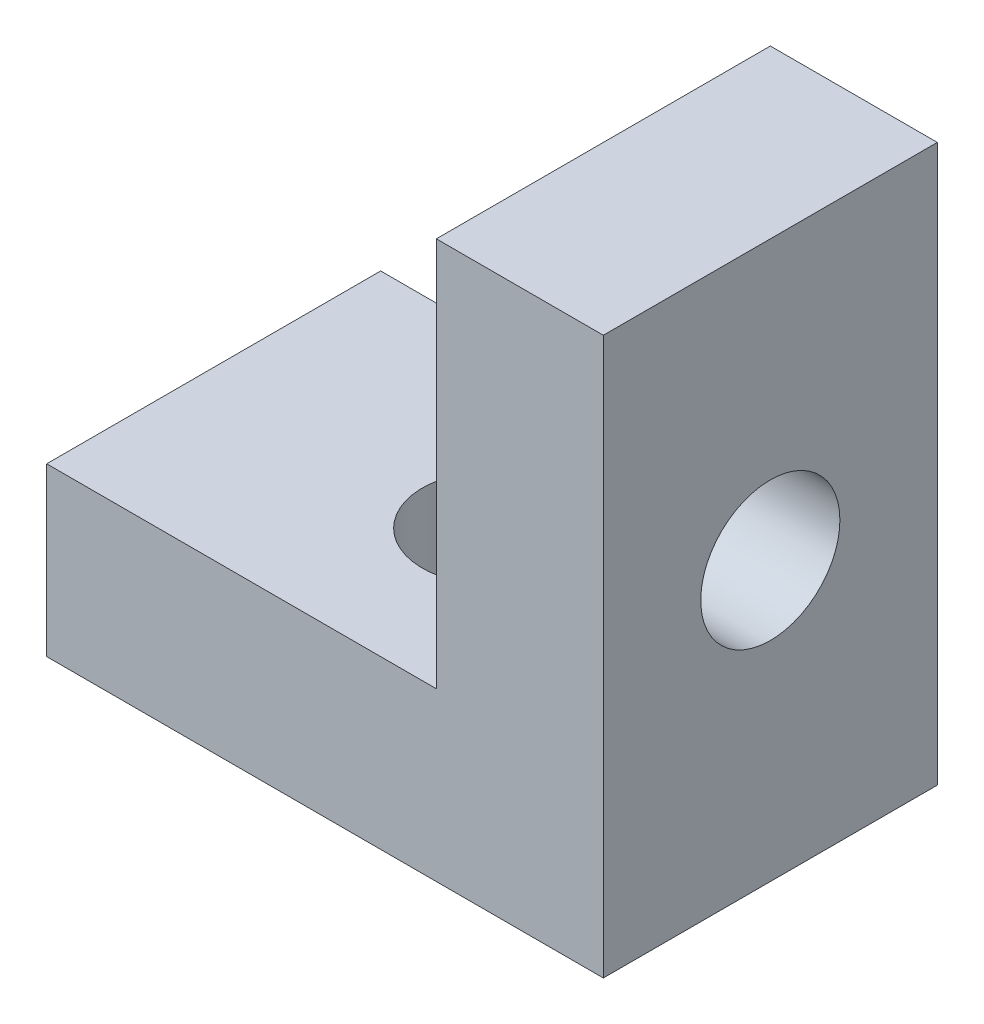
ISO-10303-21;
HEADER;
FILE_DESCRIPTION(('STEP AP214'),'2;1');
FILE_NAME('part.step','',(''),(''),'','','');
FILE_SCHEMA(('AUTOMOTIVE_DESIGN { 1 0 10303 214 1 1 1 1 }'));
ENDSEC;
DATA;
#1=APPLICATION_CONTEXT('core data for automotive mechanical design processes');
#2=APPLICATION_PROTOCOL_DEFINITION('international standard','automotive_design',2000,#1);
#3=PRODUCT_CONTEXT('',#1,'mechanical');
#4=PRODUCT('Part','Part','',(#3));
#5=PRODUCT_RELATED_PRODUCT_CATEGORY('part','',(#4));
#6=PRODUCT_DEFINITION_FORMATION('','',#4);
#7=PRODUCT_DEFINITION_CONTEXT('part definition',#1,'design');
#8=PRODUCT_DEFINITION('design','',#6,#7);
#9=PRODUCT_DEFINITION_SHAPE('','',#8);
#10=(LENGTH_UNIT() NAMED_UNIT(*) SI_UNIT(.MILLI.,.METRE.));
#11=(NAMED_UNIT(*) PLANE_ANGLE_UNIT() SI_UNIT($,.RADIAN.));
#12=(NAMED_UNIT(*) SI_UNIT($,.STERADIAN.) SOLID_ANGLE_UNIT());
#13=UNCERTAINTY_MEASURE_WITH_UNIT(LENGTH_MEASURE(1.E-05),#10,'distance_accuracy_value','');
#14=(GEOMETRIC_REPRESENTATION_CONTEXT(3) GLOBAL_UNCERTAINTY_ASSIGNED_CONTEXT((#13)) GLOBAL_UNIT_ASSIGNED_CONTEXT((#10,
#11,#12)) REPRESENTATION_CONTEXT('',''));
#15=CARTESIAN_POINT('',(0.,0.,0.));
#16=DIRECTION('',(0.,0.,1.));
#17=DIRECTION('',(1.,0.,0.));
#18=AXIS2_PLACEMENT_3D('',#15,#16,#17);
#19=CARTESIAN_POINT('',(7.,0.,6.));
#20=DIRECTION('',(0.,-1.,0.));
#21=DIRECTION('',(1.,0.,0.));
#22=AXIS2_PLACEMENT_3D('',#19,#20,#21);
#23=PLANE('',#22);
#24=CARTESIAN_POINT('',(5.,0.,3.));
#25=DIRECTION('',(0.,-1.,0.));
#26=DIRECTION('',(1.,0.,0.));
#27=AXIS2_PLACEMENT_3D('',#24,#25,#26);
#28=CIRCLE('',#27,1.24999999999999);
#29=CARTESIAN_POINT('',(6.24999999999999,0.,3.));
#30=VERTEX_POINT('',#29);
#31=EDGE_CURVE('E123',#30,#30,#28,.T.);
#32=ORIENTED_EDGE('',*,*,#31,.T.);
#33=EDGE_LOOP('',(#32));
#34=FACE_BOUND('',#33,.T.);
#35=DIRECTION('',(-1.,0.,0.));
#36=VECTOR('',#35,1.);
#37=CARTESIAN_POINT('',(7.,0.,0.));
#38=LINE('',#37,#36);
#39=CARTESIAN_POINT('',(7.,0.,0.));
#40=VERTEX_POINT('',#39);
#41=CARTESIAN_POINT('',(0.,0.,0.));
#42=VERTEX_POINT('',#41);
#43=EDGE_CURVE('E119',#40,#42,#38,.T.);
#44=ORIENTED_EDGE('',*,*,#43,.T.);
#45=DIRECTION('',(0.,0.,-1.));
#46=VECTOR('',#45,1.);
#47=CARTESIAN_POINT('',(0.,0.,6.));
#48=LINE('',#47,#46);
#49=CARTESIAN_POINT('',(0.,0.,6.));
#50=VERTEX_POINT('',#49);
#51=EDGE_CURVE('E11',#50,#42,#48,.T.);
#52=ORIENTED_EDGE('',*,*,#51,.F.);
#53=DIRECTION('',(-1.,0.,0.));
#54=VECTOR('',#53,1.);
#55=CARTESIAN_POINT('',(7.,0.,6.));
#56=LINE('',#55,#54);
#57=CARTESIAN_POINT('',(7.,0.,6.));
#58=VERTEX_POINT('',#57);
#59=EDGE_CURVE('E130',#58,#50,#56,.T.);
#60=ORIENTED_EDGE('',*,*,#59,.F.);
#61=DIRECTION('',(0.,0.,-1.));
#62=VECTOR('',#61,1.);
#63=CARTESIAN_POINT('',(7.,0.,6.));
#64=LINE('',#63,#62);
#65=EDGE_CURVE('E115',#58,#40,#64,.T.);
#66=ORIENTED_EDGE('',*,*,#65,.T.);
#67=EDGE_LOOP('',(#44,#52,#60,#66));
#68=FACE_BOUND('',#67,.T.);
#69=ADVANCED_FACE('F35',(#34,#68),#23,.F.);
#70=CARTESIAN_POINT('',(0.,0.,6.));
#71=DIRECTION('',(1.,0.,0.));
#72=DIRECTION('',(0.,0.,-1.));
#73=AXIS2_PLACEMENT_3D('',#70,#71,#72);
#74=PLANE('',#73);
#75=DIRECTION('',(0.,-1.,0.));
#76=VECTOR('',#75,1.);
#77=CARTESIAN_POINT('',(0.,0.,0.));
#78=LINE('',#77,#76);
#79=CARTESIAN_POINT('',(0.,-3.,0.));
#80=VERTEX_POINT('',#79);
#81=EDGE_CURVE('E122',#42,#80,#78,.T.);
#82=ORIENTED_EDGE('',*,*,#81,.T.);
#83=DIRECTION('',(0.,0.,-1.));
#84=VECTOR('',#83,1.);
#85=CARTESIAN_POINT('',(0.,-3.,6.));
#86=LINE('',#85,#84);
#87=CARTESIAN_POINT('',(0.,-3.,6.));
#88=VERTEX_POINT('',#87);
#89=EDGE_CURVE('E43',#88,#80,#86,.T.);
#90=ORIENTED_EDGE('',*,*,#89,.F.);
#91=DIRECTION('',(0.,-1.,0.));
#92=VECTOR('',#91,1.);
#93=CARTESIAN_POINT('',(0.,0.,6.));
#94=LINE('',#93,#92);
#95=EDGE_CURVE('E88',#50,#88,#94,.T.);
#96=ORIENTED_EDGE('',*,*,#95,.F.);
#97=ORIENTED_EDGE('',*,*,#51,.T.);
#98=EDGE_LOOP('',(#82,#90,#96,#97));
#99=FACE_BOUND('',#98,.T.);
#100=ADVANCED_FACE('F156',(#99),#74,.F.);
#101=CARTESIAN_POINT('',(0.,-3.,6.));
#102=DIRECTION('',(0.,1.,0.));
#103=DIRECTION('',(-1.,0.,0.));
#104=AXIS2_PLACEMENT_3D('',#101,#102,#103);
#105=PLANE('',#104);
#106=CARTESIAN_POINT('',(5.,-3.,3.));
#107=DIRECTION('',(0.,-1.,0.));
#108=DIRECTION('',(0.,0.,-1.));
#109=AXIS2_PLACEMENT_3D('',#106,#107,#108);
#110=CIRCLE('',#109,1.24999999999999);
#111=CARTESIAN_POINT('',(5.,-3.,1.75000000000001));
#112=VERTEX_POINT('',#111);
#113=EDGE_CURVE('E164',#112,#112,#110,.T.);
#114=ORIENTED_EDGE('',*,*,#113,.F.);
#115=EDGE_LOOP('',(#114));
#116=FACE_BOUND('',#115,.T.);
#117=DIRECTION('',(1.,0.,0.));
#118=VECTOR('',#117,1.);
#119=CARTESIAN_POINT('',(0.,-3.,0.));
#120=LINE('',#119,#118);
#121=CARTESIAN_POINT('',(10.,-3.,0.));
#122=VERTEX_POINT('',#121);
#123=EDGE_CURVE('E125',#80,#122,#120,.T.);
#124=ORIENTED_EDGE('',*,*,#123,.T.);
#125=DIRECTION('',(0.,0.,-1.));
#126=VECTOR('',#125,1.);
#127=CARTESIAN_POINT('',(10.,-3.,6.));
#128=LINE('',#127,#126);
#129=CARTESIAN_POINT('',(10.,-3.,6.));
#130=VERTEX_POINT('',#129);
#131=EDGE_CURVE('E110',#130,#122,#128,.T.);
#132=ORIENTED_EDGE('',*,*,#131,.F.);
#133=DIRECTION('',(1.,0.,0.));
#134=VECTOR('',#133,1.);
#135=CARTESIAN_POINT('',(0.,-3.,6.));
#136=LINE('',#135,#134);
#137=EDGE_CURVE('E101',#88,#130,#136,.T.);
#138=ORIENTED_EDGE('',*,*,#137,.F.);
#139=ORIENTED_EDGE('',*,*,#89,.T.);
#140=EDGE_LOOP('',(#124,#132,#138,#139));
#141=FACE_BOUND('',#140,.T.);
#142=ADVANCED_FACE('F136',(#116,#141),#105,.F.);
#143=CARTESIAN_POINT('',(10.,-3.,6.));
#144=DIRECTION('',(-1.,0.,0.));
#145=DIRECTION('',(0.,-1.,0.));
#146=AXIS2_PLACEMENT_3D('',#143,#144,#145);
#147=PLANE('',#146);
#148=CARTESIAN_POINT('',(10.,2.,3.));
#149=DIRECTION('',(1.,0.,0.));
#150=DIRECTION('',(0.,0.,-1.));
#151=AXIS2_PLACEMENT_3D('',#148,#149,#150);
#152=CIRCLE('',#151,1.24999999999999);
#153=CARTESIAN_POINT('',(10.,2.,1.75000000000001));
#154=VERTEX_POINT('',#153);
#155=EDGE_CURVE('E173',#154,#154,#152,.T.);
#156=ORIENTED_EDGE('',*,*,#155,.F.);
#157=EDGE_LOOP('',(#156));
#158=FACE_BOUND('',#157,.T.);
#159=DIRECTION('',(0.,1.,0.));
#160=VECTOR('',#159,1.);
#161=CARTESIAN_POINT('',(10.,-3.,0.));
#162=LINE('',#161,#160);
#163=CARTESIAN_POINT('',(10.,7.,0.));
#164=VERTEX_POINT('',#163);
#165=EDGE_CURVE('E109',#122,#164,#162,.T.);
#166=ORIENTED_EDGE('',*,*,#165,.T.);
#167=DIRECTION('',(0.,0.,-1.));
#168=VECTOR('',#167,1.);
#169=CARTESIAN_POINT('',(10.,7.,6.));
#170=LINE('',#169,#168);
#171=CARTESIAN_POINT('',(10.,7.,6.));
#172=VERTEX_POINT('',#171);
#173=EDGE_CURVE('E106',#172,#164,#170,.T.);
#174=ORIENTED_EDGE('',*,*,#173,.F.);
#175=DIRECTION('',(0.,1.,0.));
#176=VECTOR('',#175,1.);
#177=CARTESIAN_POINT('',(10.,-3.,6.));
#178=LINE('',#177,#176);
#179=EDGE_CURVE('E95',#130,#172,#178,.T.);
#180=ORIENTED_EDGE('',*,*,#179,.F.);
#181=ORIENTED_EDGE('',*,*,#131,.T.);
#182=EDGE_LOOP('',(#166,#174,#180,#181));
#183=FACE_BOUND('',#182,.T.);
#184=ADVANCED_FACE('F107',(#158,#183),#147,.F.);
#185=CARTESIAN_POINT('',(10.,7.,6.));
#186=DIRECTION('',(0.,-1.,0.));
#187=DIRECTION('',(0.,0.,-1.));
#188=AXIS2_PLACEMENT_3D('',#185,#186,#187);
#189=PLANE('',#188);
#190=DIRECTION('',(-1.,0.,0.));
#191=VECTOR('',#190,1.);
#192=CARTESIAN_POINT('',(10.,7.,0.));
#193=LINE('',#192,#191);
#194=CARTESIAN_POINT('',(7.,7.,0.));
#195=VERTEX_POINT('',#194);
#196=EDGE_CURVE('E74',#164,#195,#193,.T.);
#197=ORIENTED_EDGE('',*,*,#196,.T.);
#198=DIRECTION('',(0.,0.,-1.));
#199=VECTOR('',#198,1.);
#200=CARTESIAN_POINT('',(7.,7.,6.));
#201=LINE('',#200,#199);
#202=CARTESIAN_POINT('',(7.,7.,6.));
#203=VERTEX_POINT('',#202);
#204=EDGE_CURVE('E111',#203,#195,#201,.T.);
#205=ORIENTED_EDGE('',*,*,#204,.F.);
#206=DIRECTION('',(-1.,0.,0.));
#207=VECTOR('',#206,1.);
#208=CARTESIAN_POINT('',(10.,7.,6.));
#209=LINE('',#208,#207);
#210=EDGE_CURVE('E99',#172,#203,#209,.T.);
#211=ORIENTED_EDGE('',*,*,#210,.F.);
#212=ORIENTED_EDGE('',*,*,#173,.T.);
#213=EDGE_LOOP('',(#197,#205,#211,#212));
#214=FACE_BOUND('',#213,.T.);
#215=ADVANCED_FACE('F113',(#214),#189,.F.);
#216=CARTESIAN_POINT('',(7.,7.,6.));
#217=DIRECTION('',(1.,0.,0.));
#218=DIRECTION('',(0.,1.,0.));
#219=AXIS2_PLACEMENT_3D('',#216,#217,#218);
#220=PLANE('',#219);
#221=CARTESIAN_POINT('',(7.,2.,3.));
#222=DIRECTION('',(1.,0.,0.));
#223=DIRECTION('',(0.,1.,0.));
#224=AXIS2_PLACEMENT_3D('',#221,#222,#223);
#225=CIRCLE('',#224,1.24999999999999);
#226=CARTESIAN_POINT('',(7.,3.24999999999999,3.));
#227=VERTEX_POINT('',#226);
#228=EDGE_CURVE('E167',#227,#227,#225,.T.);
#229=ORIENTED_EDGE('',*,*,#228,.T.);
#230=EDGE_LOOP('',(#229));
#231=FACE_BOUND('',#230,.T.);
#232=DIRECTION('',(0.,-1.,0.));
#233=VECTOR('',#232,1.);
#234=CARTESIAN_POINT('',(7.,7.,0.));
#235=LINE('',#234,#233);
#236=EDGE_CURVE('E80',#195,#40,#235,.T.);
#237=ORIENTED_EDGE('',*,*,#236,.T.);
#238=ORIENTED_EDGE('',*,*,#65,.F.);
#239=DIRECTION('',(0.,-1.,0.));
#240=VECTOR('',#239,1.);
#241=CARTESIAN_POINT('',(7.,7.,6.));
#242=LINE('',#241,#240);
#243=EDGE_CURVE('E51',#203,#58,#242,.T.);
#244=ORIENTED_EDGE('',*,*,#243,.F.);
#245=ORIENTED_EDGE('',*,*,#204,.T.);
#246=EDGE_LOOP('',(#237,#238,#244,#245));
#247=FACE_BOUND('',#246,.T.);
#248=ADVANCED_FACE('F143',(#231,#247),#220,.F.);
#249=CARTESIAN_POINT('',(0.,0.,6.));
#250=DIRECTION('',(0.,0.,1.));
#251=DIRECTION('',(1.,0.,0.));
#252=AXIS2_PLACEMENT_3D('',#249,#250,#251);
#253=PLANE('',#252);
#254=ORIENTED_EDGE('',*,*,#59,.T.);
#255=ORIENTED_EDGE('',*,*,#95,.T.);
#256=ORIENTED_EDGE('',*,*,#137,.T.);
#257=ORIENTED_EDGE('',*,*,#179,.T.);
#258=ORIENTED_EDGE('',*,*,#210,.T.);
#259=ORIENTED_EDGE('',*,*,#243,.T.);
#260=EDGE_LOOP('',(#254,#255,#256,#257,#258,#259));
#261=FACE_BOUND('',#260,.T.);
#262=ADVANCED_FACE('F97',(#261),#253,.T.);
#263=CARTESIAN_POINT('',(0.,0.,0.));
#264=DIRECTION('',(0.,0.,1.));
#265=DIRECTION('',(1.,0.,0.));
#266=AXIS2_PLACEMENT_3D('',#263,#264,#265);
#267=PLANE('',#266);
#268=ORIENTED_EDGE('',*,*,#43,.F.);
#269=ORIENTED_EDGE('',*,*,#236,.F.);
#270=ORIENTED_EDGE('',*,*,#196,.F.);
#271=ORIENTED_EDGE('',*,*,#165,.F.);
#272=ORIENTED_EDGE('',*,*,#123,.F.);
#273=ORIENTED_EDGE('',*,*,#81,.F.);
#274=EDGE_LOOP('',(#268,#269,#270,#271,#272,#273));
#275=FACE_BOUND('',#274,.T.);
#276=ADVANCED_FACE('F139',(#275),#267,.F.);
#277=CARTESIAN_POINT('',(5.,-3.,3.));
#278=DIRECTION('',(0.,-1.,0.));
#279=DIRECTION('',(0.,0.,-1.));
#280=AXIS2_PLACEMENT_3D('',#277,#278,#279);
#281=CYLINDRICAL_SURFACE('',#280,1.24999999999999);
#282=ORIENTED_EDGE('',*,*,#113,.T.);
#283=EDGE_LOOP('',(#282));
#284=FACE_BOUND('',#283,.T.);
#285=ORIENTED_EDGE('',*,*,#31,.F.);
#286=EDGE_LOOP('',(#285));
#287=FACE_BOUND('',#286,.T.);
#288=ADVANCED_FACE('F191',(#284,#287),#281,.F.);
#289=CARTESIAN_POINT('',(10.,2.,3.));
#290=DIRECTION('',(1.,0.,0.));
#291=DIRECTION('',(0.,0.,-1.));
#292=AXIS2_PLACEMENT_3D('',#289,#290,#291);
#293=CYLINDRICAL_SURFACE('',#292,1.24999999999999);
#294=ORIENTED_EDGE('',*,*,#155,.T.);
#295=EDGE_LOOP('',(#294));
#296=FACE_BOUND('',#295,.T.);
#297=ORIENTED_EDGE('',*,*,#228,.F.);
#298=EDGE_LOOP('',(#297));
#299=FACE_BOUND('',#298,.T.);
#300=ADVANCED_FACE('F177',(#296,#299),#293,.F.);
#301=CLOSED_SHELL('',(#69,#100,#142,#184,#215,#248,#262,#276,#288,#300));
#302=MANIFOLD_SOLID_BREP('B2',#301);
#303=ADVANCED_BREP_SHAPE_REPRESENTATION('',(#18,#302),#14);
#304=SHAPE_DEFINITION_REPRESENTATION(#9,#303);
ENDSEC;
END-ISO-10303-21;
